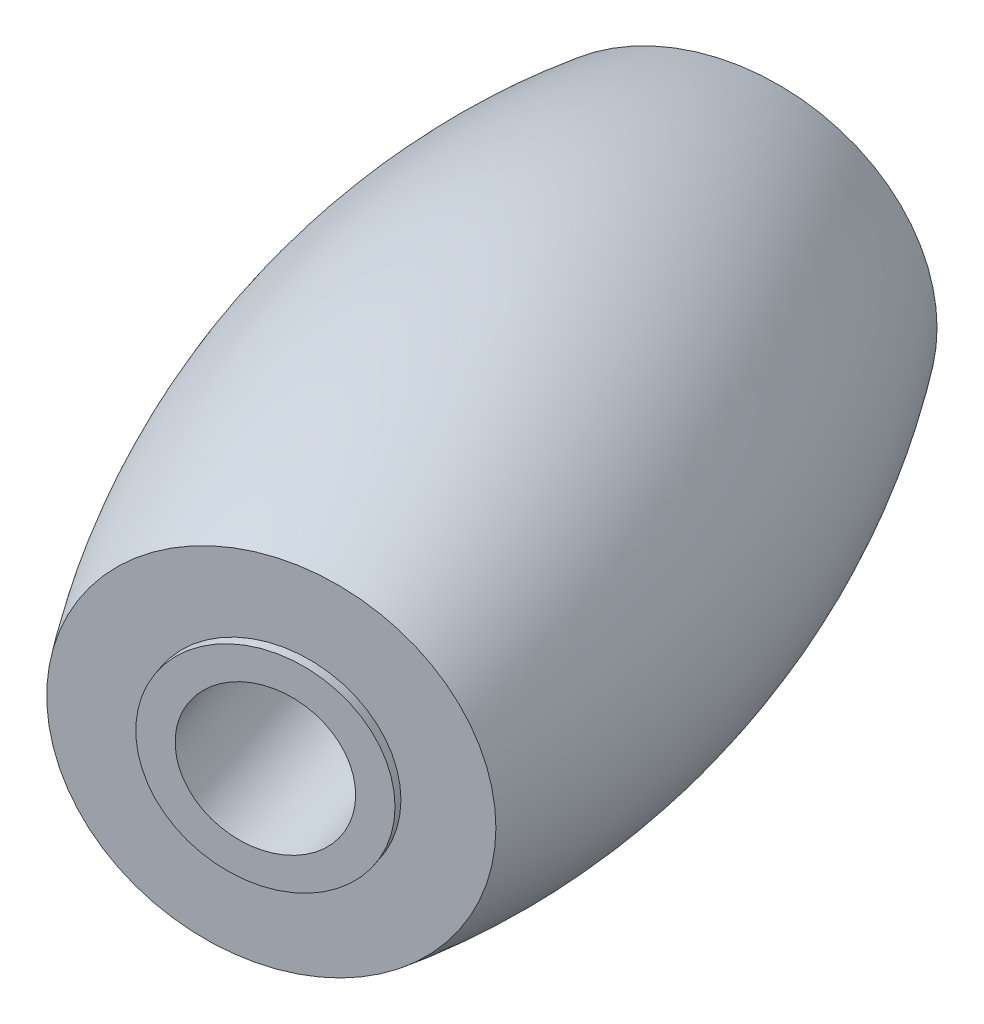
ISO-10303-21;
HEADER;
FILE_DESCRIPTION(('STEP AP214'),'2;1');
FILE_NAME('part.step','',(''),(''),'','','');
FILE_SCHEMA(('AUTOMOTIVE_DESIGN { 1 0 10303 214 1 1 1 1 }'));
ENDSEC;
DATA;
#1=APPLICATION_CONTEXT('core data for automotive mechanical design processes');
#2=APPLICATION_PROTOCOL_DEFINITION('international standard','automotive_design',2000,#1);
#3=PRODUCT_CONTEXT('',#1,'mechanical');
#4=PRODUCT('Part','Part','',(#3));
#5=PRODUCT_RELATED_PRODUCT_CATEGORY('part','',(#4));
#6=PRODUCT_DEFINITION_FORMATION('','',#4);
#7=PRODUCT_DEFINITION_CONTEXT('part definition',#1,'design');
#8=PRODUCT_DEFINITION('design','',#6,#7);
#9=PRODUCT_DEFINITION_SHAPE('','',#8);
#10=(LENGTH_UNIT() NAMED_UNIT(*) SI_UNIT(.MILLI.,.METRE.));
#11=(NAMED_UNIT(*) PLANE_ANGLE_UNIT() SI_UNIT($,.RADIAN.));
#12=(NAMED_UNIT(*) SI_UNIT($,.STERADIAN.) SOLID_ANGLE_UNIT());
#13=UNCERTAINTY_MEASURE_WITH_UNIT(LENGTH_MEASURE(1.E-05),#10,'distance_accuracy_value','');
#14=(GEOMETRIC_REPRESENTATION_CONTEXT(3) GLOBAL_UNCERTAINTY_ASSIGNED_CONTEXT((#13)) GLOBAL_UNIT_ASSIGNED_CONTEXT((#10,
#11,#12)) REPRESENTATION_CONTEXT('',''));
#15=CARTESIAN_POINT('',(0.,0.,0.));
#16=DIRECTION('',(0.,0.,1.));
#17=DIRECTION('',(1.,0.,0.));
#18=AXIS2_PLACEMENT_3D('',#15,#16,#17);
#19=CARTESIAN_POINT('',(-19.9699883723619,19.5,-3.61554258726951));
#20=CARTESIAN_POINT('',(-15.8660091682241,19.5,1.72103131730326));
#21=CARTESIAN_POINT('',(-13.7856644781697,19.5,8.1236739215351));
#22=CARTESIAN_POINT('',(-13.9690939600027,19.5,14.8533113539795));
#23=(BOUNDED_CURVE() B_SPLINE_CURVE(3,(#19,#20,#21,#22),.UNSPECIFIED.,.F.,
.F.) B_SPLINE_CURVE_WITH_KNOTS((4,4),(0.,1.),
.UNSPECIFIED.) CURVE() GEOMETRIC_REPRESENTATION_ITEM() RATIONAL_B_SPLINE_CURVE((1.,
0.961522456838992,0.961522456838992,1.)) REPRESENTATION_ITEM(''));
#24=CARTESIAN_POINT('',(-21.46445003076,19.5,7.079368806224));
#25=DIRECTION('',(0.30901699437927,0.,0.951056516293749));
#26=AXIS1_PLACEMENT('',#24,#25);
#27=SURFACE_OF_REVOLUTION('',#23,#26);
#28=CARTESIAN_POINT('',(-24.3537589282125,19.5,-1.81300962114201));
#29=DIRECTION('',(0.30901699437927,0.,0.951056516293749));
#30=DIRECTION('',(0.951056516293749,0.,-0.30901699437927));
#31=AXIS2_PLACEMENT_3D('',#28,#29,#30);
#32=CIRCLE('',#31,4.85136608625301);
#33=CARTESIAN_POINT('',(-19.7398355989551,19.5,-3.31216418774944));
#34=VERTEX_POINT('',#33);
#35=EDGE_CURVE('E19',#34,#34,#32,.T.);
#36=ORIENTED_EDGE('',*,*,#35,.T.);
#37=EDGE_LOOP('',(#36));
#38=FACE_BOUND('',#37,.T.);
#39=CARTESIAN_POINT('',(-18.575141133319,19.5,15.9717472335547));
#40=DIRECTION('',(0.30901699437927,0.,0.951056516293749));
#41=DIRECTION('',(0.951056516293749,0.,-0.30901699437927));
#42=AXIS2_PLACEMENT_3D('',#39,#40,#41);
#43=CIRCLE('',#42,4.85136608619719);
#44=CARTESIAN_POINT('',(-13.9612178041146,19.5,14.4725926669645));
#45=VERTEX_POINT('',#44);
#46=EDGE_CURVE('E45',#45,#45,#43,.F.);
#47=ORIENTED_EDGE('',*,*,#46,.T.);
#48=EDGE_LOOP('',(#47));
#49=FACE_BOUND('',#48,.T.);
#50=ADVANCED_FACE('F15',(#38,#49),#27,.T.);
#51=CARTESIAN_POINT('',(-29.15223919057,14.45457927032,-0.253888871894));
#52=DIRECTION('',(0.309016994375086,0.,0.951056516295109));
#53=DIRECTION('',(0.951056516295109,0.,-0.309016994375086));
#54=AXIS2_PLACEMENT_3D('',#51,#52,#53);
#55=PLANE('',#54);
#56=CARTESIAN_POINT('',(-24.3537589281644,19.5,-1.81300962114804));
#57=DIRECTION('',(0.309016994379567,0.,0.951056516293653));
#58=DIRECTION('',(0.951056516293653,0.,-0.309016994379567));
#59=AXIS2_PLACEMENT_3D('',#56,#57,#58);
#60=CIRCLE('',#59,2.79999999999651);
#61=CARTESIAN_POINT('',(-21.6908006825455,19.5,-2.67825720540975));
#62=VERTEX_POINT('',#61);
#63=EDGE_CURVE('E43',#62,#62,#60,.T.);
#64=ORIENTED_EDGE('',*,*,#63,.T.);
#65=EDGE_LOOP('',(#64));
#66=FACE_BOUND('',#65,.T.);
#67=ORIENTED_EDGE('',*,*,#35,.F.);
#68=EDGE_LOOP('',(#67));
#69=FACE_BOUND('',#68,.T.);
#70=ADVANCED_FACE('F53',(#66,#69),#55,.F.);
#71=CARTESIAN_POINT('',(-23.37362139576,14.45457927032,17.53086798283));
#72=DIRECTION('',(0.309016994375803,0.,0.951056516294876));
#73=DIRECTION('',(0.951056516294876,0.,-0.309016994375803));
#74=AXIS2_PLACEMENT_3D('',#71,#72,#73);
#75=PLANE('',#74);
#76=CARTESIAN_POINT('',(-18.575141133268,19.5,15.9717472335389));
#77=DIRECTION('',(0.309016994379568,0.,0.951056516293652));
#78=DIRECTION('',(0.951056516293652,0.,-0.309016994379568));
#79=AXIS2_PLACEMENT_3D('',#76,#77,#78);
#80=CIRCLE('',#79,2.7999999999046);
#81=CARTESIAN_POINT('',(-15.9121828877365,19.5,15.1064996493056));
#82=VERTEX_POINT('',#81);
#83=EDGE_CURVE('E40',#82,#82,#80,.F.);
#84=ORIENTED_EDGE('',*,*,#83,.T.);
#85=EDGE_LOOP('',(#84));
#86=FACE_BOUND('',#85,.T.);
#87=ORIENTED_EDGE('',*,*,#46,.F.);
#88=EDGE_LOOP('',(#87));
#89=FACE_BOUND('',#88,.T.);
#90=ADVANCED_FACE('F55',(#86,#89),#75,.T.);
#91=CARTESIAN_POINT('',(-24.4310131767515,19.5,-2.0507737501973));
#92=DIRECTION('',(0.309016994379567,0.,0.951056516293653));
#93=DIRECTION('',(0.951056516293653,0.,-0.309016994379567));
#94=AXIS2_PLACEMENT_3D('',#91,#92,#93);
#95=CYLINDRICAL_SURFACE('',#94,2.79999999999651);
#96=ORIENTED_EDGE('',*,*,#63,.F.);
#97=EDGE_LOOP('',(#96));
#98=FACE_BOUND('',#97,.T.);
#99=CARTESIAN_POINT('',(-24.4310131767515,19.5,-2.0507737501973));
#100=DIRECTION('',(0.309016994379567,0.,0.951056516293653));
#101=DIRECTION('',(0.951056516293653,0.,-0.309016994379567));
#102=AXIS2_PLACEMENT_3D('',#99,#100,#101);
#103=CIRCLE('',#102,2.79999999999651);
#104=CARTESIAN_POINT('',(-21.7680549311325,19.5,-2.91602133445901));
#105=VERTEX_POINT('',#104);
#106=EDGE_CURVE('E37',#105,#105,#103,.T.);
#107=ORIENTED_EDGE('',*,*,#106,.T.);
#108=EDGE_LOOP('',(#107));
#109=FACE_BOUND('',#108,.T.);
#110=ADVANCED_FACE('F63',(#98,#109),#95,.T.);
#111=CARTESIAN_POINT('',(-18.575141133268,19.5,15.9717472335389));
#112=DIRECTION('',(0.309016994379568,0.,0.951056516293652));
#113=DIRECTION('',(0.951056516293652,0.,-0.309016994379568));
#114=AXIS2_PLACEMENT_3D('',#111,#112,#113);
#115=CYLINDRICAL_SURFACE('',#114,2.7999999999046);
#116=ORIENTED_EDGE('',*,*,#83,.F.);
#117=EDGE_LOOP('',(#116));
#118=FACE_BOUND('',#117,.T.);
#119=CARTESIAN_POINT('',(-18.4978868846631,19.5,16.209511362643));
#120=DIRECTION('',(0.309016994379568,0.,0.951056516293652));
#121=DIRECTION('',(0.951056516293652,0.,-0.309016994379568));
#122=AXIS2_PLACEMENT_3D('',#119,#120,#121);
#123=CIRCLE('',#122,2.7999999999046);
#124=CARTESIAN_POINT('',(-15.8349286391316,19.5,15.3442637784097));
#125=VERTEX_POINT('',#124);
#126=EDGE_CURVE('E28',#125,#125,#123,.F.);
#127=ORIENTED_EDGE('',*,*,#126,.T.);
#128=EDGE_LOOP('',(#127));
#129=FACE_BOUND('',#128,.T.);
#130=ADVANCED_FACE('F78',(#118,#129),#115,.T.);
#131=CARTESIAN_POINT('',(-27.20048975221,16.58437656076,-1.150916262589));
#132=DIRECTION('',(0.309016994375145,0.,0.951056516295089));
#133=DIRECTION('',(0.951056516295089,0.,-0.309016994375145));
#134=AXIS2_PLACEMENT_3D('',#131,#132,#133);
#135=PLANE('',#134);
#136=CARTESIAN_POINT('',(-24.4310131767587,19.5,-2.05077375021951));
#137=DIRECTION('',(0.309016994379567,0.,0.951056516293653));
#138=DIRECTION('',(0.951056516293653,0.,-0.309016994379567));
#139=AXIS2_PLACEMENT_3D('',#136,#137,#138);
#140=CIRCLE('',#139,1.94999999995429);
#141=CARTESIAN_POINT('',(-22.5764529700295,19.5,-2.65335688924554));
#142=VERTEX_POINT('',#141);
#143=EDGE_CURVE('E23',#142,#142,#140,.T.);
#144=ORIENTED_EDGE('',*,*,#143,.T.);
#145=EDGE_LOOP('',(#144));
#146=FACE_BOUND('',#145,.T.);
#147=ORIENTED_EDGE('',*,*,#106,.F.);
#148=EDGE_LOOP('',(#147));
#149=FACE_BOUND('',#148,.T.);
#150=ADVANCED_FACE('F74',(#146,#149),#135,.F.);
#151=CARTESIAN_POINT('',(-21.26736346021,16.58437656076,17.10936885028));
#152=DIRECTION('',(0.309016994375145,0.,0.951056516295089));
#153=DIRECTION('',(0.951056516295089,0.,-0.309016994375145));
#154=AXIS2_PLACEMENT_3D('',#151,#152,#153);
#155=PLANE('',#154);
#156=CARTESIAN_POINT('',(-18.4978868846644,19.5,16.209511362639));
#157=DIRECTION('',(0.309016994379567,0.,0.951056516293653));
#158=DIRECTION('',(0.951056516293653,0.,-0.309016994379567));
#159=AXIS2_PLACEMENT_3D('',#156,#157,#158);
#160=CIRCLE('',#159,1.94999999995429);
#161=CARTESIAN_POINT('',(-16.6433266779352,19.5,15.606928223613));
#162=VERTEX_POINT('',#161);
#163=EDGE_CURVE('E10',#162,#162,#160,.F.);
#164=ORIENTED_EDGE('',*,*,#163,.T.);
#165=EDGE_LOOP('',(#164));
#166=FACE_BOUND('',#165,.T.);
#167=ORIENTED_EDGE('',*,*,#126,.F.);
#168=EDGE_LOOP('',(#167));
#169=FACE_BOUND('',#168,.T.);
#170=ADVANCED_FACE('F17',(#166,#169),#155,.T.);
#171=CARTESIAN_POINT('',(-24.4310131767587,19.5,-2.05077375021951));
#172=DIRECTION('',(0.309016994379567,0.,0.951056516293653));
#173=DIRECTION('',(0.951056516293653,0.,-0.309016994379567));
#174=AXIS2_PLACEMENT_3D('',#171,#172,#173);
#175=CYLINDRICAL_SURFACE('',#174,1.94999999995429);
#176=ORIENTED_EDGE('',*,*,#143,.F.);
#177=EDGE_LOOP('',(#176));
#178=FACE_BOUND('',#177,.T.);
#179=ORIENTED_EDGE('',*,*,#163,.F.);
#180=EDGE_LOOP('',(#179));
#181=FACE_BOUND('',#180,.T.);
#182=ADVANCED_FACE('F67',(#178,#181),#175,.F.);
#183=CLOSED_SHELL('',(#50,#70,#90,#110,#130,#150,#170,#182));
#184=MANIFOLD_SOLID_BREP('B1',#183);
#185=ADVANCED_BREP_SHAPE_REPRESENTATION('',(#18,#184),#14);
#186=SHAPE_DEFINITION_REPRESENTATION(#9,#185);
ENDSEC;
END-ISO-10303-21;
